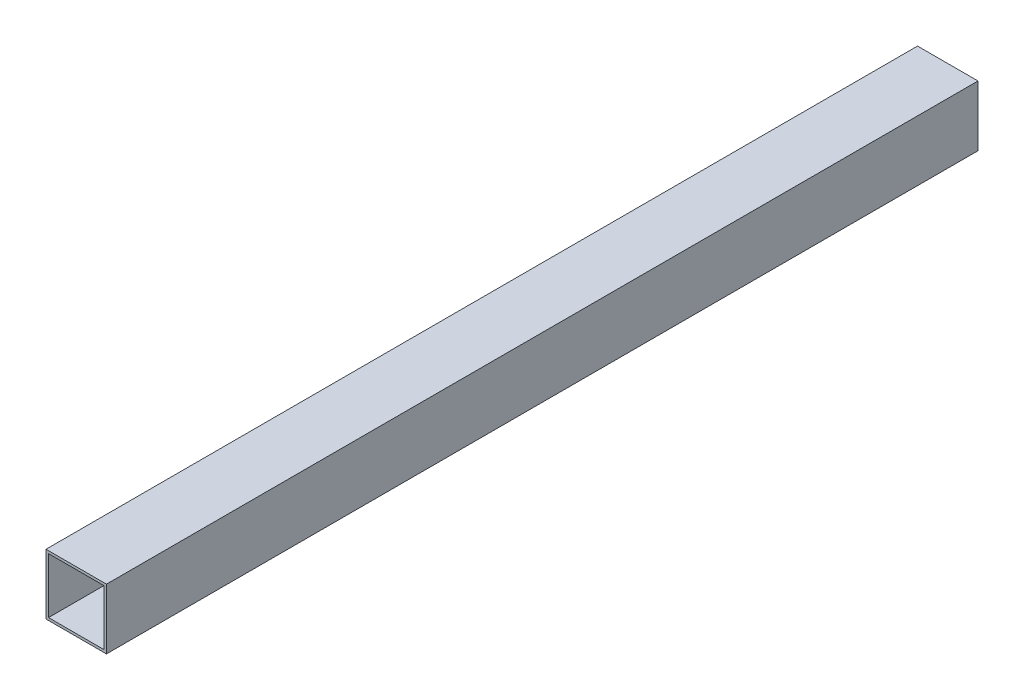
ISO-10303-21;
HEADER;
FILE_DESCRIPTION(('STEP AP214'),'2;1');
FILE_NAME('part.step','',(''),(''),'','','');
FILE_SCHEMA(('AUTOMOTIVE_DESIGN { 1 0 10303 214 1 1 1 1 }'));
ENDSEC;
DATA;
#1=APPLICATION_CONTEXT('core data for automotive mechanical design processes');
#2=APPLICATION_PROTOCOL_DEFINITION('international standard','automotive_design',2000,#1);
#3=PRODUCT_CONTEXT('',#1,'mechanical');
#4=PRODUCT('Part','Part','',(#3));
#5=PRODUCT_RELATED_PRODUCT_CATEGORY('part','',(#4));
#6=PRODUCT_DEFINITION_FORMATION('','',#4);
#7=PRODUCT_DEFINITION_CONTEXT('part definition',#1,'design');
#8=PRODUCT_DEFINITION('design','',#6,#7);
#9=PRODUCT_DEFINITION_SHAPE('','',#8);
#10=(LENGTH_UNIT() NAMED_UNIT(*) SI_UNIT(.MILLI.,.METRE.));
#11=(NAMED_UNIT(*) PLANE_ANGLE_UNIT() SI_UNIT($,.RADIAN.));
#12=(NAMED_UNIT(*) SI_UNIT($,.STERADIAN.) SOLID_ANGLE_UNIT());
#13=UNCERTAINTY_MEASURE_WITH_UNIT(LENGTH_MEASURE(1.E-05),#10,'distance_accuracy_value','');
#14=(GEOMETRIC_REPRESENTATION_CONTEXT(3) GLOBAL_UNCERTAINTY_ASSIGNED_CONTEXT((#13)) GLOBAL_UNIT_ASSIGNED_CONTEXT((#10,
#11,#12)) REPRESENTATION_CONTEXT('',''));
#15=CARTESIAN_POINT('',(0.,0.,0.));
#16=DIRECTION('',(0.,0.,1.));
#17=DIRECTION('',(1.,0.,0.));
#18=AXIS2_PLACEMENT_3D('',#15,#16,#17);
#19=CARTESIAN_POINT('',(0.,0.,1098.55));
#20=DIRECTION('',(0.,0.,-1.));
#21=DIRECTION('',(-1.,0.,0.));
#22=AXIS2_PLACEMENT_3D('',#19,#20,#21);
#23=PLANE('',#22);
#24=DIRECTION('',(1.,0.,0.));
#25=VECTOR('',#24,1.);
#26=CARTESIAN_POINT('',(-40.7297095879192,18.6309754178664,1098.55));
#27=LINE('',#26,#25);
#28=CARTESIAN_POINT('',(-40.7297095879192,18.6309754178664,1098.55));
#29=VERTEX_POINT('',#28);
#30=CARTESIAN_POINT('',(35.4702904120808,18.6309754178664,1098.55));
#31=VERTEX_POINT('',#30);
#32=EDGE_CURVE('E143',#29,#31,#27,.T.);
#33=ORIENTED_EDGE('',*,*,#32,.F.);
#34=DIRECTION('',(0.,-1.,0.));
#35=VECTOR('',#34,1.);
#36=CARTESIAN_POINT('',(-40.7297095879192,18.6309754178664,1098.55));
#37=LINE('',#36,#35);
#38=CARTESIAN_POINT('',(-40.7297095879192,-57.5690245821336,1098.55));
#39=VERTEX_POINT('',#38);
#40=EDGE_CURVE('E152',#29,#39,#37,.T.);
#41=ORIENTED_EDGE('',*,*,#40,.T.);
#42=DIRECTION('',(1.,0.,0.));
#43=VECTOR('',#42,1.);
#44=CARTESIAN_POINT('',(-40.7297095879192,-57.5690245821336,1098.55));
#45=LINE('',#44,#43);
#46=CARTESIAN_POINT('',(35.4702904120808,-57.5690245821336,1098.55));
#47=VERTEX_POINT('',#46);
#48=EDGE_CURVE('E150',#39,#47,#45,.T.);
#49=ORIENTED_EDGE('',*,*,#48,.T.);
#50=DIRECTION('',(0.,-1.,0.));
#51=VECTOR('',#50,1.);
#52=CARTESIAN_POINT('',(35.4702904120808,18.6309754178664,1098.55));
#53=LINE('',#52,#51);
#54=EDGE_CURVE('E146',#31,#47,#53,.T.);
#55=ORIENTED_EDGE('',*,*,#54,.F.);
#56=EDGE_LOOP('',(#33,#41,#49,#55));
#57=FACE_BOUND('',#56,.T.);
#58=DIRECTION('',(1.,0.,0.));
#59=VECTOR('',#58,1.);
#60=CARTESIAN_POINT('',(-37.5547095879192,15.4559754178664,1098.55));
#61=LINE('',#60,#59);
#62=CARTESIAN_POINT('',(-37.5547095879192,15.4559754178664,1098.55));
#63=VERTEX_POINT('',#62);
#64=CARTESIAN_POINT('',(32.2952904120808,15.4559754178664,1098.55));
#65=VERTEX_POINT('',#64);
#66=EDGE_CURVE('E58',#63,#65,#61,.T.);
#67=ORIENTED_EDGE('',*,*,#66,.T.);
#68=DIRECTION('',(0.,-1.,0.));
#69=VECTOR('',#68,1.);
#70=CARTESIAN_POINT('',(32.2952904120808,15.4559754178664,1098.55));
#71=LINE('',#70,#69);
#72=CARTESIAN_POINT('',(32.2952904120808,-54.3940245821336,1098.55));
#73=VERTEX_POINT('',#72);
#74=EDGE_CURVE('E122',#65,#73,#71,.T.);
#75=ORIENTED_EDGE('',*,*,#74,.T.);
#76=DIRECTION('',(1.,0.,0.));
#77=VECTOR('',#76,1.);
#78=CARTESIAN_POINT('',(-37.5547095879192,-54.3940245821336,1098.55));
#79=LINE('',#78,#77);
#80=CARTESIAN_POINT('',(-37.5547095879192,-54.3940245821336,1098.55));
#81=VERTEX_POINT('',#80);
#82=EDGE_CURVE('E134',#81,#73,#79,.T.);
#83=ORIENTED_EDGE('',*,*,#82,.F.);
#84=DIRECTION('',(0.,-1.,0.));
#85=VECTOR('',#84,1.);
#86=CARTESIAN_POINT('',(-37.5547095879192,15.4559754178664,1098.55));
#87=LINE('',#86,#85);
#88=EDGE_CURVE('E117',#63,#81,#87,.T.);
#89=ORIENTED_EDGE('',*,*,#88,.F.);
#90=EDGE_LOOP('',(#67,#75,#83,#89));
#91=FACE_BOUND('',#90,.T.);
#92=ADVANCED_FACE('F41',(#57,#91),#23,.F.);
#93=CARTESIAN_POINT('',(0.,0.,0.));
#94=DIRECTION('',(0.,0.,-1.));
#95=DIRECTION('',(-1.,0.,0.));
#96=AXIS2_PLACEMENT_3D('',#93,#94,#95);
#97=PLANE('',#96);
#98=DIRECTION('',(1.,0.,0.));
#99=VECTOR('',#98,1.);
#100=CARTESIAN_POINT('',(-40.7297095879192,18.6309754178664,0.));
#101=LINE('',#100,#99);
#102=CARTESIAN_POINT('',(-40.7297095879192,18.6309754178664,0.));
#103=VERTEX_POINT('',#102);
#104=CARTESIAN_POINT('',(35.4702904120808,18.6309754178664,0.));
#105=VERTEX_POINT('',#104);
#106=EDGE_CURVE('E123',#103,#105,#101,.T.);
#107=ORIENTED_EDGE('',*,*,#106,.T.);
#108=DIRECTION('',(0.,-1.,0.));
#109=VECTOR('',#108,1.);
#110=CARTESIAN_POINT('',(35.4702904120808,18.6309754178664,0.));
#111=LINE('',#110,#109);
#112=CARTESIAN_POINT('',(35.4702904120808,-57.5690245821336,0.));
#113=VERTEX_POINT('',#112);
#114=EDGE_CURVE('E156',#105,#113,#111,.T.);
#115=ORIENTED_EDGE('',*,*,#114,.T.);
#116=DIRECTION('',(1.,0.,0.));
#117=VECTOR('',#116,1.);
#118=CARTESIAN_POINT('',(-40.7297095879192,-57.5690245821336,0.));
#119=LINE('',#118,#117);
#120=CARTESIAN_POINT('',(-40.7297095879192,-57.5690245821336,0.));
#121=VERTEX_POINT('',#120);
#122=EDGE_CURVE('E159',#121,#113,#119,.T.);
#123=ORIENTED_EDGE('',*,*,#122,.F.);
#124=DIRECTION('',(0.,-1.,0.));
#125=VECTOR('',#124,1.);
#126=CARTESIAN_POINT('',(-40.7297095879192,18.6309754178664,0.));
#127=LINE('',#126,#125);
#128=EDGE_CURVE('E147',#103,#121,#127,.T.);
#129=ORIENTED_EDGE('',*,*,#128,.F.);
#130=EDGE_LOOP('',(#107,#115,#123,#129));
#131=FACE_BOUND('',#130,.T.);
#132=DIRECTION('',(0.,-1.,0.));
#133=VECTOR('',#132,1.);
#134=CARTESIAN_POINT('',(32.2952904120808,15.4559754178664,0.));
#135=LINE('',#134,#133);
#136=CARTESIAN_POINT('',(32.2952904120808,15.4559754178664,0.));
#137=VERTEX_POINT('',#136);
#138=CARTESIAN_POINT('',(32.2952904120808,-54.3940245821336,0.));
#139=VERTEX_POINT('',#138);
#140=EDGE_CURVE('E116',#137,#139,#135,.T.);
#141=ORIENTED_EDGE('',*,*,#140,.F.);
#142=DIRECTION('',(1.,0.,0.));
#143=VECTOR('',#142,1.);
#144=CARTESIAN_POINT('',(-37.5547095879192,15.4559754178664,0.));
#145=LINE('',#144,#143);
#146=CARTESIAN_POINT('',(-37.5547095879192,15.4559754178664,0.));
#147=VERTEX_POINT('',#146);
#148=EDGE_CURVE('E107',#147,#137,#145,.T.);
#149=ORIENTED_EDGE('',*,*,#148,.F.);
#150=DIRECTION('',(0.,-1.,0.));
#151=VECTOR('',#150,1.);
#152=CARTESIAN_POINT('',(-37.5547095879192,15.4559754178664,0.));
#153=LINE('',#152,#151);
#154=CARTESIAN_POINT('',(-37.5547095879192,-54.3940245821336,0.));
#155=VERTEX_POINT('',#154);
#156=EDGE_CURVE('E128',#147,#155,#153,.T.);
#157=ORIENTED_EDGE('',*,*,#156,.T.);
#158=DIRECTION('',(1.,0.,0.));
#159=VECTOR('',#158,1.);
#160=CARTESIAN_POINT('',(-37.5547095879192,-54.3940245821336,0.));
#161=LINE('',#160,#159);
#162=EDGE_CURVE('E66',#155,#139,#161,.T.);
#163=ORIENTED_EDGE('',*,*,#162,.T.);
#164=EDGE_LOOP('',(#141,#149,#157,#163));
#165=FACE_BOUND('',#164,.T.);
#166=ADVANCED_FACE('F126',(#131,#165),#97,.T.);
#167=CARTESIAN_POINT('',(-40.7297095879192,18.6309754178664,1098.55));
#168=DIRECTION('',(0.,1.,0.));
#169=DIRECTION('',(0.,0.,1.));
#170=AXIS2_PLACEMENT_3D('',#167,#168,#169);
#171=PLANE('',#170);
#172=ORIENTED_EDGE('',*,*,#106,.F.);
#173=DIRECTION('',(0.,0.,-1.));
#174=VECTOR('',#173,1.);
#175=CARTESIAN_POINT('',(-40.7297095879192,18.6309754178664,1098.55));
#176=LINE('',#175,#174);
#177=EDGE_CURVE('E11',#29,#103,#176,.T.);
#178=ORIENTED_EDGE('',*,*,#177,.F.);
#179=ORIENTED_EDGE('',*,*,#32,.T.);
#180=DIRECTION('',(0.,0.,-1.));
#181=VECTOR('',#180,1.);
#182=CARTESIAN_POINT('',(35.4702904120808,18.6309754178664,1098.55));
#183=LINE('',#182,#181);
#184=EDGE_CURVE('E45',#31,#105,#183,.T.);
#185=ORIENTED_EDGE('',*,*,#184,.T.);
#186=EDGE_LOOP('',(#172,#178,#179,#185));
#187=FACE_BOUND('',#186,.T.);
#188=ADVANCED_FACE('F43',(#187),#171,.T.);
#189=CARTESIAN_POINT('',(-40.7297095879192,18.6309754178664,1098.55));
#190=DIRECTION('',(1.,0.,0.));
#191=DIRECTION('',(0.,0.,-1.));
#192=AXIS2_PLACEMENT_3D('',#189,#190,#191);
#193=PLANE('',#192);
#194=ORIENTED_EDGE('',*,*,#128,.T.);
#195=DIRECTION('',(0.,0.,-1.));
#196=VECTOR('',#195,1.);
#197=CARTESIAN_POINT('',(-40.7297095879192,-57.5690245821336,1098.55));
#198=LINE('',#197,#196);
#199=EDGE_CURVE('E50',#39,#121,#198,.T.);
#200=ORIENTED_EDGE('',*,*,#199,.F.);
#201=ORIENTED_EDGE('',*,*,#40,.F.);
#202=ORIENTED_EDGE('',*,*,#177,.T.);
#203=EDGE_LOOP('',(#194,#200,#201,#202));
#204=FACE_BOUND('',#203,.T.);
#205=ADVANCED_FACE('F178',(#204),#193,.F.);
#206=CARTESIAN_POINT('',(-40.7297095879192,-57.5690245821336,1098.55));
#207=DIRECTION('',(0.,1.,0.));
#208=DIRECTION('',(-1.,0.,0.));
#209=AXIS2_PLACEMENT_3D('',#206,#207,#208);
#210=PLANE('',#209);
#211=ORIENTED_EDGE('',*,*,#122,.T.);
#212=DIRECTION('',(0.,0.,-1.));
#213=VECTOR('',#212,1.);
#214=CARTESIAN_POINT('',(35.4702904120808,-57.5690245821336,1098.55));
#215=LINE('',#214,#213);
#216=EDGE_CURVE('E164',#47,#113,#215,.T.);
#217=ORIENTED_EDGE('',*,*,#216,.F.);
#218=ORIENTED_EDGE('',*,*,#48,.F.);
#219=ORIENTED_EDGE('',*,*,#199,.T.);
#220=EDGE_LOOP('',(#211,#217,#218,#219));
#221=FACE_BOUND('',#220,.T.);
#222=ADVANCED_FACE('F182',(#221),#210,.F.);
#223=CARTESIAN_POINT('',(35.4702904120808,18.6309754178664,1098.55));
#224=DIRECTION('',(1.,0.,0.));
#225=DIRECTION('',(0.,0.,-1.));
#226=AXIS2_PLACEMENT_3D('',#223,#224,#225);
#227=PLANE('',#226);
#228=ORIENTED_EDGE('',*,*,#114,.F.);
#229=ORIENTED_EDGE('',*,*,#184,.F.);
#230=ORIENTED_EDGE('',*,*,#54,.T.);
#231=ORIENTED_EDGE('',*,*,#216,.T.);
#232=EDGE_LOOP('',(#228,#229,#230,#231));
#233=FACE_BOUND('',#232,.T.);
#234=ADVANCED_FACE('F172',(#233),#227,.T.);
#235=CARTESIAN_POINT('',(-37.5547095879192,15.4559754178664,0.));
#236=DIRECTION('',(0.,-1.,0.));
#237=DIRECTION('',(0.,0.,-1.));
#238=AXIS2_PLACEMENT_3D('',#235,#236,#237);
#239=PLANE('',#238);
#240=ORIENTED_EDGE('',*,*,#66,.F.);
#241=DIRECTION('',(0.,0.,1.));
#242=VECTOR('',#241,1.);
#243=CARTESIAN_POINT('',(-37.5547095879192,15.4559754178664,0.));
#244=LINE('',#243,#242);
#245=EDGE_CURVE('E111',#147,#63,#244,.T.);
#246=ORIENTED_EDGE('',*,*,#245,.F.);
#247=ORIENTED_EDGE('',*,*,#148,.T.);
#248=DIRECTION('',(0.,0.,1.));
#249=VECTOR('',#248,1.);
#250=CARTESIAN_POINT('',(32.2952904120808,15.4559754178664,0.));
#251=LINE('',#250,#249);
#252=EDGE_CURVE('E110',#137,#65,#251,.T.);
#253=ORIENTED_EDGE('',*,*,#252,.T.);
#254=EDGE_LOOP('',(#240,#246,#247,#253));
#255=FACE_BOUND('',#254,.T.);
#256=ADVANCED_FACE('F109',(#255),#239,.T.);
#257=CARTESIAN_POINT('',(32.2952904120808,15.4559754178664,0.));
#258=DIRECTION('',(-1.,0.,0.));
#259=DIRECTION('',(0.,-1.,0.));
#260=AXIS2_PLACEMENT_3D('',#257,#258,#259);
#261=PLANE('',#260);
#262=ORIENTED_EDGE('',*,*,#74,.F.);
#263=ORIENTED_EDGE('',*,*,#252,.F.);
#264=ORIENTED_EDGE('',*,*,#140,.T.);
#265=DIRECTION('',(0.,0.,1.));
#266=VECTOR('',#265,1.);
#267=CARTESIAN_POINT('',(32.2952904120808,-54.3940245821336,0.));
#268=LINE('',#267,#266);
#269=EDGE_CURVE('E124',#139,#73,#268,.T.);
#270=ORIENTED_EDGE('',*,*,#269,.T.);
#271=EDGE_LOOP('',(#262,#263,#264,#270));
#272=FACE_BOUND('',#271,.T.);
#273=ADVANCED_FACE('F120',(#272),#261,.T.);
#274=CARTESIAN_POINT('',(-37.5547095879192,-54.3940245821336,0.));
#275=DIRECTION('',(0.,-1.,0.));
#276=DIRECTION('',(0.,0.,-1.));
#277=AXIS2_PLACEMENT_3D('',#274,#275,#276);
#278=PLANE('',#277);
#279=ORIENTED_EDGE('',*,*,#82,.T.);
#280=ORIENTED_EDGE('',*,*,#269,.F.);
#281=ORIENTED_EDGE('',*,*,#162,.F.);
#282=DIRECTION('',(0.,0.,1.));
#283=VECTOR('',#282,1.);
#284=CARTESIAN_POINT('',(-37.5547095879192,-54.3940245821336,0.));
#285=LINE('',#284,#283);
#286=EDGE_CURVE('E140',#155,#81,#285,.T.);
#287=ORIENTED_EDGE('',*,*,#286,.T.);
#288=EDGE_LOOP('',(#279,#280,#281,#287));
#289=FACE_BOUND('',#288,.T.);
#290=ADVANCED_FACE('F191',(#289),#278,.F.);
#291=CARTESIAN_POINT('',(-37.5547095879192,15.4559754178664,0.));
#292=DIRECTION('',(-1.,0.,0.));
#293=DIRECTION('',(0.,-1.,0.));
#294=AXIS2_PLACEMENT_3D('',#291,#292,#293);
#295=PLANE('',#294);
#296=ORIENTED_EDGE('',*,*,#88,.T.);
#297=ORIENTED_EDGE('',*,*,#286,.F.);
#298=ORIENTED_EDGE('',*,*,#156,.F.);
#299=ORIENTED_EDGE('',*,*,#245,.T.);
#300=EDGE_LOOP('',(#296,#297,#298,#299));
#301=FACE_BOUND('',#300,.T.);
#302=ADVANCED_FACE('F190',(#301),#295,.F.);
#303=CLOSED_SHELL('',(#92,#166,#188,#205,#222,#234,#256,#273,#290,#302));
#304=MANIFOLD_SOLID_BREP('B2',#303);
#305=ADVANCED_BREP_SHAPE_REPRESENTATION('',(#18,#304),#14);
#306=SHAPE_DEFINITION_REPRESENTATION(#9,#305);
ENDSEC;
END-ISO-10303-21;
